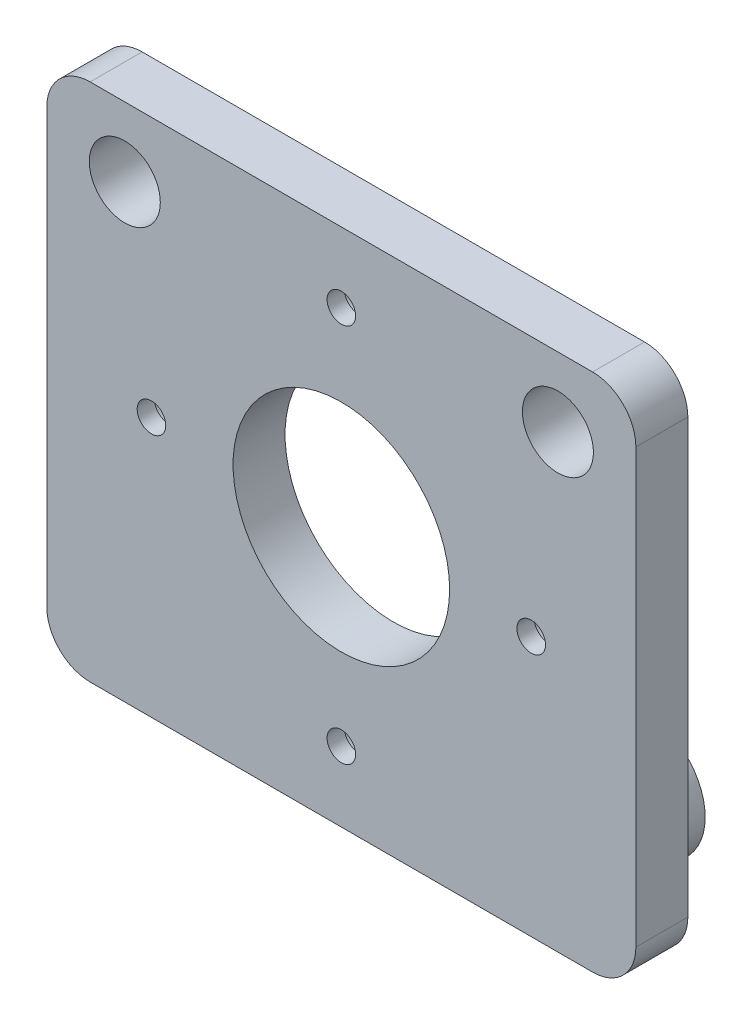
ISO-10303-21;
HEADER;
FILE_DESCRIPTION(('STEP AP214'),'2;1');
FILE_NAME('part.step','',(''),(''),'','','');
FILE_SCHEMA(('AUTOMOTIVE_DESIGN { 1 0 10303 214 1 1 1 1 }'));
ENDSEC;
DATA;
#1=APPLICATION_CONTEXT('core data for automotive mechanical design processes');
#2=APPLICATION_PROTOCOL_DEFINITION('international standard','automotive_design',2000,#1);
#3=PRODUCT_CONTEXT('',#1,'mechanical');
#4=PRODUCT('Part','Part','',(#3));
#5=PRODUCT_RELATED_PRODUCT_CATEGORY('part','',(#4));
#6=PRODUCT_DEFINITION_FORMATION('','',#4);
#7=PRODUCT_DEFINITION_CONTEXT('part definition',#1,'design');
#8=PRODUCT_DEFINITION('design','',#6,#7);
#9=PRODUCT_DEFINITION_SHAPE('','',#8);
#10=(LENGTH_UNIT() NAMED_UNIT(*) SI_UNIT(.MILLI.,.METRE.));
#11=(NAMED_UNIT(*) PLANE_ANGLE_UNIT() SI_UNIT($,.RADIAN.));
#12=(NAMED_UNIT(*) SI_UNIT($,.STERADIAN.) SOLID_ANGLE_UNIT());
#13=UNCERTAINTY_MEASURE_WITH_UNIT(LENGTH_MEASURE(1.E-05),#10,'distance_accuracy_value','');
#14=(GEOMETRIC_REPRESENTATION_CONTEXT(3) GLOBAL_UNCERTAINTY_ASSIGNED_CONTEXT((#13)) GLOBAL_UNIT_ASSIGNED_CONTEXT((#10,
#11,#12)) REPRESENTATION_CONTEXT('',''));
#15=CARTESIAN_POINT('',(0.,0.,0.));
#16=DIRECTION('',(0.,0.,1.));
#17=DIRECTION('',(1.,0.,0.));
#18=AXIS2_PLACEMENT_3D('',#15,#16,#17);
#19=CARTESIAN_POINT('',(0.,-21.920310216783,348.));
#20=DIRECTION('',(0.,0.,1.));
#21=DIRECTION('',(1.,0.,0.));
#22=AXIS2_PLACEMENT_3D('',#19,#20,#21);
#23=CYLINDRICAL_SURFACE('',#22,1.65);
#24=CARTESIAN_POINT('',(0.,-21.920310216783,354.));
#25=DIRECTION('',(0.,0.,1.));
#26=DIRECTION('',(1.,0.,0.));
#27=AXIS2_PLACEMENT_3D('',#24,#25,#26);
#28=CIRCLE('',#27,1.65);
#29=CARTESIAN_POINT('',(1.64999999999993,-21.920310216783,354.));
#30=VERTEX_POINT('',#29);
#31=EDGE_CURVE('E178',#30,#30,#28,.T.);
#32=ORIENTED_EDGE('',*,*,#31,.T.);
#33=EDGE_LOOP('',(#32));
#34=FACE_BOUND('',#33,.T.);
#35=CARTESIAN_POINT('',(0.,-21.920310216783,352.));
#36=DIRECTION('',(0.,0.,1.));
#37=DIRECTION('',(1.,0.,0.));
#38=AXIS2_PLACEMENT_3D('',#35,#36,#37);
#39=CIRCLE('',#38,1.65);
#40=CARTESIAN_POINT('',(1.64999999999993,-21.920310216783,352.));
#41=VERTEX_POINT('',#40);
#42=EDGE_CURVE('E435',#41,#41,#39,.T.);
#43=ORIENTED_EDGE('',*,*,#42,.F.);
#44=EDGE_LOOP('',(#43));
#45=FACE_BOUND('',#44,.T.);
#46=ADVANCED_FACE('F16',(#34,#45),#23,.F.);
#47=CARTESIAN_POINT('',(21.9203102167829,0.,348.));
#48=DIRECTION('',(0.,0.,1.));
#49=DIRECTION('',(1.,0.,0.));
#50=AXIS2_PLACEMENT_3D('',#47,#48,#49);
#51=CYLINDRICAL_SURFACE('',#50,1.65);
#52=CARTESIAN_POINT('',(21.9203102167829,0.,354.));
#53=DIRECTION('',(0.,0.,1.));
#54=DIRECTION('',(1.,0.,0.));
#55=AXIS2_PLACEMENT_3D('',#52,#53,#54);
#56=CIRCLE('',#55,1.65);
#57=CARTESIAN_POINT('',(23.5703102167829,0.,354.));
#58=VERTEX_POINT('',#57);
#59=EDGE_CURVE('E174',#58,#58,#56,.T.);
#60=ORIENTED_EDGE('',*,*,#59,.T.);
#61=EDGE_LOOP('',(#60));
#62=FACE_BOUND('',#61,.T.);
#63=CARTESIAN_POINT('',(21.9203102167829,0.,352.));
#64=DIRECTION('',(0.,0.,1.));
#65=DIRECTION('',(1.,0.,0.));
#66=AXIS2_PLACEMENT_3D('',#63,#64,#65);
#67=CIRCLE('',#66,1.65);
#68=CARTESIAN_POINT('',(23.5703102167829,0.,352.));
#69=VERTEX_POINT('',#68);
#70=EDGE_CURVE('E474',#69,#69,#67,.T.);
#71=ORIENTED_EDGE('',*,*,#70,.F.);
#72=EDGE_LOOP('',(#71));
#73=FACE_BOUND('',#72,.T.);
#74=ADVANCED_FACE('F286',(#62,#73),#51,.F.);
#75=CARTESIAN_POINT('',(0.,21.920310216783,348.));
#76=DIRECTION('',(0.,0.,1.));
#77=DIRECTION('',(1.,0.,0.));
#78=AXIS2_PLACEMENT_3D('',#75,#76,#77);
#79=CYLINDRICAL_SURFACE('',#78,1.65);
#80=CARTESIAN_POINT('',(0.,21.920310216783,354.));
#81=DIRECTION('',(0.,0.,1.));
#82=DIRECTION('',(1.,0.,0.));
#83=AXIS2_PLACEMENT_3D('',#80,#81,#82);
#84=CIRCLE('',#83,1.65);
#85=CARTESIAN_POINT('',(1.64999999999992,21.920310216783,354.));
#86=VERTEX_POINT('',#85);
#87=EDGE_CURVE('E170',#86,#86,#84,.T.);
#88=ORIENTED_EDGE('',*,*,#87,.T.);
#89=EDGE_LOOP('',(#88));
#90=FACE_BOUND('',#89,.T.);
#91=CARTESIAN_POINT('',(0.,21.920310216783,352.));
#92=DIRECTION('',(0.,0.,1.));
#93=DIRECTION('',(1.,0.,0.));
#94=AXIS2_PLACEMENT_3D('',#91,#92,#93);
#95=CIRCLE('',#94,1.65);
#96=CARTESIAN_POINT('',(1.64999999999992,21.920310216783,352.));
#97=VERTEX_POINT('',#96);
#98=EDGE_CURVE('E462',#97,#97,#95,.T.);
#99=ORIENTED_EDGE('',*,*,#98,.F.);
#100=EDGE_LOOP('',(#99));
#101=FACE_BOUND('',#100,.T.);
#102=ADVANCED_FACE('F292',(#90,#101),#79,.F.);
#103=CARTESIAN_POINT('',(-21.9203102167831,0.,348.));
#104=DIRECTION('',(0.,0.,1.));
#105=DIRECTION('',(1.,0.,0.));
#106=AXIS2_PLACEMENT_3D('',#103,#104,#105);
#107=CYLINDRICAL_SURFACE('',#106,1.65);
#108=CARTESIAN_POINT('',(-21.9203102167831,0.,354.));
#109=DIRECTION('',(0.,0.,1.));
#110=DIRECTION('',(1.,0.,0.));
#111=AXIS2_PLACEMENT_3D('',#108,#109,#110);
#112=CIRCLE('',#111,1.65);
#113=CARTESIAN_POINT('',(-20.2703102167831,0.,354.));
#114=VERTEX_POINT('',#113);
#115=EDGE_CURVE('E182',#114,#114,#112,.T.);
#116=ORIENTED_EDGE('',*,*,#115,.T.);
#117=EDGE_LOOP('',(#116));
#118=FACE_BOUND('',#117,.T.);
#119=CARTESIAN_POINT('',(-21.9203102167831,0.,352.));
#120=DIRECTION('',(0.,0.,1.));
#121=DIRECTION('',(1.,0.,0.));
#122=AXIS2_PLACEMENT_3D('',#119,#120,#121);
#123=CIRCLE('',#122,1.65);
#124=CARTESIAN_POINT('',(-20.2703102167831,0.,352.));
#125=VERTEX_POINT('',#124);
#126=EDGE_CURVE('E452',#125,#125,#123,.T.);
#127=ORIENTED_EDGE('',*,*,#126,.F.);
#128=EDGE_LOOP('',(#127));
#129=FACE_BOUND('',#128,.T.);
#130=ADVANCED_FACE('F297',(#118,#129),#107,.F.);
#131=CARTESIAN_POINT('',(34.,0.,348.));
#132=DIRECTION('',(-1.,0.,0.));
#133=DIRECTION('',(0.,-1.,0.));
#134=AXIS2_PLACEMENT_3D('',#131,#132,#133);
#135=PLANE('',#134);
#136=DIRECTION('',(0.,-1.,0.));
#137=VECTOR('',#136,1.);
#138=CARTESIAN_POINT('',(34.,0.,348.));
#139=LINE('',#138,#137);
#140=CARTESIAN_POINT('',(34.,25.,348.));
#141=VERTEX_POINT('',#140);
#142=CARTESIAN_POINT('',(34.,-25.,348.));
#143=VERTEX_POINT('',#142);
#144=EDGE_CURVE('E125',#141,#143,#139,.T.);
#145=ORIENTED_EDGE('',*,*,#144,.F.);
#146=DIRECTION('',(0.,0.,1.));
#147=VECTOR('',#146,1.);
#148=CARTESIAN_POINT('',(34.,25.,354.));
#149=LINE('',#148,#147);
#150=CARTESIAN_POINT('',(34.,25.,354.));
#151=VERTEX_POINT('',#150);
#152=EDGE_CURVE('E108',#141,#151,#149,.T.);
#153=ORIENTED_EDGE('',*,*,#152,.T.);
#154=DIRECTION('',(0.,-1.,0.));
#155=VECTOR('',#154,1.);
#156=CARTESIAN_POINT('',(34.,0.,354.));
#157=LINE('',#156,#155);
#158=CARTESIAN_POINT('',(34.,-25.,354.));
#159=VERTEX_POINT('',#158);
#160=EDGE_CURVE('E122',#151,#159,#157,.T.);
#161=ORIENTED_EDGE('',*,*,#160,.T.);
#162=DIRECTION('',(0.,0.,1.));
#163=VECTOR('',#162,1.);
#164=CARTESIAN_POINT('',(34.,-25.,348.));
#165=LINE('',#164,#163);
#166=EDGE_CURVE('E128',#159,#143,#165,.F.);
#167=ORIENTED_EDGE('',*,*,#166,.T.);
#168=EDGE_LOOP('',(#145,#153,#161,#167));
#169=FACE_BOUND('',#168,.T.);
#170=ADVANCED_FACE('F121',(#169),#135,.F.);
#171=CARTESIAN_POINT('',(0.,30.,348.));
#172=DIRECTION('',(0.,1.,0.));
#173=DIRECTION('',(-1.,0.,0.));
#174=AXIS2_PLACEMENT_3D('',#171,#172,#173);
#175=PLANE('',#174);
#176=DIRECTION('',(-1.,0.,0.));
#177=VECTOR('',#176,1.);
#178=CARTESIAN_POINT('',(0.,30.,354.));
#179=LINE('',#178,#177);
#180=CARTESIAN_POINT('',(29.,30.,354.));
#181=VERTEX_POINT('',#180);
#182=CARTESIAN_POINT('',(-29.,30.,354.));
#183=VERTEX_POINT('',#182);
#184=EDGE_CURVE('E134',#181,#183,#179,.T.);
#185=ORIENTED_EDGE('',*,*,#184,.F.);
#186=DIRECTION('',(0.,0.,1.));
#187=VECTOR('',#186,1.);
#188=CARTESIAN_POINT('',(29.,30.,348.));
#189=LINE('',#188,#187);
#190=CARTESIAN_POINT('',(29.,30.,348.));
#191=VERTEX_POINT('',#190);
#192=EDGE_CURVE('E109',#181,#191,#189,.F.);
#193=ORIENTED_EDGE('',*,*,#192,.T.);
#194=DIRECTION('',(-1.,0.,0.));
#195=VECTOR('',#194,1.);
#196=CARTESIAN_POINT('',(0.,30.,348.));
#197=LINE('',#196,#195);
#198=CARTESIAN_POINT('',(-29.,30.,348.));
#199=VERTEX_POINT('',#198);
#200=EDGE_CURVE('E238',#191,#199,#197,.T.);
#201=ORIENTED_EDGE('',*,*,#200,.T.);
#202=DIRECTION('',(0.,0.,1.));
#203=VECTOR('',#202,1.);
#204=CARTESIAN_POINT('',(-29.,30.,348.));
#205=LINE('',#204,#203);
#206=EDGE_CURVE('E115',#199,#183,#205,.T.);
#207=ORIENTED_EDGE('',*,*,#206,.T.);
#208=EDGE_LOOP('',(#185,#193,#201,#207));
#209=FACE_BOUND('',#208,.T.);
#210=ADVANCED_FACE('F319',(#209),#175,.T.);
#211=CARTESIAN_POINT('',(-34.,0.,348.));
#212=DIRECTION('',(-1.,0.,0.));
#213=DIRECTION('',(0.,-1.,0.));
#214=AXIS2_PLACEMENT_3D('',#211,#212,#213);
#215=PLANE('',#214);
#216=DIRECTION('',(0.,-1.,0.));
#217=VECTOR('',#216,1.);
#218=CARTESIAN_POINT('',(-34.,0.,354.));
#219=LINE('',#218,#217);
#220=CARTESIAN_POINT('',(-34.,25.,354.));
#221=VERTEX_POINT('',#220);
#222=CARTESIAN_POINT('',(-34.,-25.,354.));
#223=VERTEX_POINT('',#222);
#224=EDGE_CURVE('E141',#221,#223,#219,.T.);
#225=ORIENTED_EDGE('',*,*,#224,.F.);
#226=DIRECTION('',(0.,0.,1.));
#227=VECTOR('',#226,1.);
#228=CARTESIAN_POINT('',(-34.,25.,348.));
#229=LINE('',#228,#227);
#230=CARTESIAN_POINT('',(-34.,25.,348.));
#231=VERTEX_POINT('',#230);
#232=EDGE_CURVE('E48',#221,#231,#229,.F.);
#233=ORIENTED_EDGE('',*,*,#232,.T.);
#234=DIRECTION('',(0.,-1.,0.));
#235=VECTOR('',#234,1.);
#236=CARTESIAN_POINT('',(-34.,0.,348.));
#237=LINE('',#236,#235);
#238=CARTESIAN_POINT('',(-34.,-25.,348.));
#239=VERTEX_POINT('',#238);
#240=EDGE_CURVE('E235',#231,#239,#237,.T.);
#241=ORIENTED_EDGE('',*,*,#240,.T.);
#242=DIRECTION('',(0.,0.,1.));
#243=VECTOR('',#242,1.);
#244=CARTESIAN_POINT('',(-34.,-25.,354.));
#245=LINE('',#244,#243);
#246=EDGE_CURVE('E215',#239,#223,#245,.T.);
#247=ORIENTED_EDGE('',*,*,#246,.T.);
#248=EDGE_LOOP('',(#225,#233,#241,#247));
#249=FACE_BOUND('',#248,.T.);
#250=ADVANCED_FACE('F234',(#249),#215,.T.);
#251=CARTESIAN_POINT('',(0.,0.,348.));
#252=DIRECTION('',(0.,0.,1.));
#253=DIRECTION('',(1.,0.,0.));
#254=AXIS2_PLACEMENT_3D('',#251,#252,#253);
#255=CYLINDRICAL_SURFACE('',#254,12.5);
#256=CARTESIAN_POINT('',(0.,0.,348.));
#257=DIRECTION('',(0.,0.,1.));
#258=DIRECTION('',(1.,0.,0.));
#259=AXIS2_PLACEMENT_3D('',#256,#257,#258);
#260=CIRCLE('',#259,12.5);
#261=CARTESIAN_POINT('',(12.4999999999999,0.,348.));
#262=VERTEX_POINT('',#261);
#263=EDGE_CURVE('E148',#262,#262,#260,.T.);
#264=ORIENTED_EDGE('',*,*,#263,.F.);
#265=EDGE_LOOP('',(#264));
#266=FACE_BOUND('',#265,.T.);
#267=CARTESIAN_POINT('',(0.,0.,354.));
#268=DIRECTION('',(0.,0.,1.));
#269=DIRECTION('',(1.,0.,0.));
#270=AXIS2_PLACEMENT_3D('',#267,#268,#269);
#271=CIRCLE('',#270,12.5);
#272=CARTESIAN_POINT('',(12.4999999999999,0.,354.));
#273=VERTEX_POINT('',#272);
#274=EDGE_CURVE('E166',#273,#273,#271,.T.);
#275=ORIENTED_EDGE('',*,*,#274,.T.);
#276=EDGE_LOOP('',(#275));
#277=FACE_BOUND('',#276,.T.);
#278=ADVANCED_FACE('F303',(#266,#277),#255,.F.);
#279=CARTESIAN_POINT('',(-25.,22.,348.));
#280=DIRECTION('',(0.,0.,1.));
#281=DIRECTION('',(1.,0.,0.));
#282=AXIS2_PLACEMENT_3D('',#279,#280,#281);
#283=CYLINDRICAL_SURFACE('',#282,4.1);
#284=CARTESIAN_POINT('',(-25.,22.,348.));
#285=DIRECTION('',(0.,0.,1.));
#286=DIRECTION('',(1.,0.,0.));
#287=AXIS2_PLACEMENT_3D('',#284,#285,#286);
#288=CIRCLE('',#287,4.1);
#289=CARTESIAN_POINT('',(-20.9,22.,348.));
#290=VERTEX_POINT('',#289);
#291=EDGE_CURVE('E251',#290,#290,#288,.T.);
#292=ORIENTED_EDGE('',*,*,#291,.F.);
#293=EDGE_LOOP('',(#292));
#294=FACE_BOUND('',#293,.T.);
#295=CARTESIAN_POINT('',(-25.,22.,354.));
#296=DIRECTION('',(0.,0.,1.));
#297=DIRECTION('',(1.,0.,0.));
#298=AXIS2_PLACEMENT_3D('',#295,#296,#297);
#299=CIRCLE('',#298,4.1);
#300=CARTESIAN_POINT('',(-20.9,22.,354.));
#301=VERTEX_POINT('',#300);
#302=EDGE_CURVE('E162',#301,#301,#299,.T.);
#303=ORIENTED_EDGE('',*,*,#302,.T.);
#304=EDGE_LOOP('',(#303));
#305=FACE_BOUND('',#304,.T.);
#306=ADVANCED_FACE('F306',(#294,#305),#283,.F.);
#307=CARTESIAN_POINT('',(25.,22.,348.));
#308=DIRECTION('',(0.,0.,1.));
#309=DIRECTION('',(1.,0.,0.));
#310=AXIS2_PLACEMENT_3D('',#307,#308,#309);
#311=CYLINDRICAL_SURFACE('',#310,4.1);
#312=CARTESIAN_POINT('',(25.,22.,348.));
#313=DIRECTION('',(0.,0.,1.));
#314=DIRECTION('',(1.,0.,0.));
#315=AXIS2_PLACEMENT_3D('',#312,#313,#314);
#316=CIRCLE('',#315,4.1);
#317=CARTESIAN_POINT('',(29.1,22.,348.));
#318=VERTEX_POINT('',#317);
#319=EDGE_CURVE('E242',#318,#318,#316,.T.);
#320=ORIENTED_EDGE('',*,*,#319,.F.);
#321=EDGE_LOOP('',(#320));
#322=FACE_BOUND('',#321,.T.);
#323=CARTESIAN_POINT('',(25.,22.,354.));
#324=DIRECTION('',(0.,0.,1.));
#325=DIRECTION('',(1.,0.,0.));
#326=AXIS2_PLACEMENT_3D('',#323,#324,#325);
#327=CIRCLE('',#326,4.1);
#328=CARTESIAN_POINT('',(29.1,22.,354.));
#329=VERTEX_POINT('',#328);
#330=EDGE_CURVE('E158',#329,#329,#327,.T.);
#331=ORIENTED_EDGE('',*,*,#330,.T.);
#332=EDGE_LOOP('',(#331));
#333=FACE_BOUND('',#332,.T.);
#334=ADVANCED_FACE('F310',(#322,#333),#311,.F.);
#335=CARTESIAN_POINT('',(0.,-30.,348.));
#336=DIRECTION('',(0.,1.,0.));
#337=DIRECTION('',(-1.,0.,0.));
#338=AXIS2_PLACEMENT_3D('',#335,#336,#337);
#339=PLANE('',#338);
#340=DIRECTION('',(-1.,0.,0.));
#341=VECTOR('',#340,1.);
#342=CARTESIAN_POINT('',(0.,-30.,354.));
#343=LINE('',#342,#341);
#344=CARTESIAN_POINT('',(29.,-30.,354.));
#345=VERTEX_POINT('',#344);
#346=CARTESIAN_POINT('',(-29.,-30.,354.));
#347=VERTEX_POINT('',#346);
#348=EDGE_CURVE('E154',#345,#347,#343,.T.);
#349=ORIENTED_EDGE('',*,*,#348,.T.);
#350=DIRECTION('',(0.,0.,1.));
#351=VECTOR('',#350,1.);
#352=CARTESIAN_POINT('',(-29.,-30.,348.));
#353=LINE('',#352,#351);
#354=CARTESIAN_POINT('',(-29.,-30.,348.));
#355=VERTEX_POINT('',#354);
#356=EDGE_CURVE('E10',#347,#355,#353,.F.);
#357=ORIENTED_EDGE('',*,*,#356,.T.);
#358=DIRECTION('',(-1.,0.,0.));
#359=VECTOR('',#358,1.);
#360=CARTESIAN_POINT('',(0.,-30.,348.));
#361=LINE('',#360,#359);
#362=CARTESIAN_POINT('',(29.,-30.,348.));
#363=VERTEX_POINT('',#362);
#364=EDGE_CURVE('E228',#363,#355,#361,.T.);
#365=ORIENTED_EDGE('',*,*,#364,.F.);
#366=DIRECTION('',(0.,0.,1.));
#367=VECTOR('',#366,1.);
#368=CARTESIAN_POINT('',(29.,-30.,348.));
#369=LINE('',#368,#367);
#370=EDGE_CURVE('E25',#363,#345,#369,.T.);
#371=ORIENTED_EDGE('',*,*,#370,.T.);
#372=EDGE_LOOP('',(#349,#357,#365,#371));
#373=FACE_BOUND('',#372,.T.);
#374=ADVANCED_FACE('F226',(#373),#339,.F.);
#375=CARTESIAN_POINT('',(0.,0.,348.));
#376=DIRECTION('',(0.,0.,1.));
#377=DIRECTION('',(1.,0.,0.));
#378=AXIS2_PLACEMENT_3D('',#375,#376,#377);
#379=PLANE('',#378);
#380=CARTESIAN_POINT('',(0.,-21.920310216783,348.));
#381=DIRECTION('',(0.,0.,-1.));
#382=DIRECTION('',(1.,0.,0.));
#383=AXIS2_PLACEMENT_3D('',#380,#381,#382);
#384=CIRCLE('',#383,3.);
#385=CARTESIAN_POINT('',(2.99999999999993,-21.920310216783,348.));
#386=VERTEX_POINT('',#385);
#387=EDGE_CURVE('E440',#386,#386,#384,.T.);
#388=ORIENTED_EDGE('',*,*,#387,.F.);
#389=EDGE_LOOP('',(#388));
#390=FACE_BOUND('',#389,.T.);
#391=CARTESIAN_POINT('',(-21.9203102167831,0.,348.));
#392=DIRECTION('',(0.,0.,-1.));
#393=DIRECTION('',(1.,0.,0.));
#394=AXIS2_PLACEMENT_3D('',#391,#392,#393);
#395=CIRCLE('',#394,3.);
#396=CARTESIAN_POINT('',(-18.9203102167831,0.,348.));
#397=VERTEX_POINT('',#396);
#398=EDGE_CURVE('E456',#397,#397,#395,.T.);
#399=ORIENTED_EDGE('',*,*,#398,.F.);
#400=EDGE_LOOP('',(#399));
#401=FACE_BOUND('',#400,.T.);
#402=CARTESIAN_POINT('',(0.,21.920310216783,348.));
#403=DIRECTION('',(0.,0.,-1.));
#404=DIRECTION('',(1.,0.,0.));
#405=AXIS2_PLACEMENT_3D('',#402,#403,#404);
#406=CIRCLE('',#405,3.);
#407=CARTESIAN_POINT('',(2.99999999999992,21.920310216783,348.));
#408=VERTEX_POINT('',#407);
#409=EDGE_CURVE('E467',#408,#408,#406,.T.);
#410=ORIENTED_EDGE('',*,*,#409,.F.);
#411=EDGE_LOOP('',(#410));
#412=FACE_BOUND('',#411,.T.);
#413=CARTESIAN_POINT('',(21.9203102167829,0.,348.));
#414=DIRECTION('',(0.,0.,-1.));
#415=DIRECTION('',(1.,0.,0.));
#416=AXIS2_PLACEMENT_3D('',#413,#414,#415);
#417=CIRCLE('',#416,3.);
#418=CARTESIAN_POINT('',(24.9203102167829,0.,348.));
#419=VERTEX_POINT('',#418);
#420=EDGE_CURVE('E479',#419,#419,#417,.T.);
#421=ORIENTED_EDGE('',*,*,#420,.F.);
#422=EDGE_LOOP('',(#421));
#423=FACE_BOUND('',#422,.T.);
#424=CARTESIAN_POINT('',(-25.,-18.,348.));
#425=DIRECTION('',(0.,0.,1.));
#426=DIRECTION('',(1.,0.,0.));
#427=AXIS2_PLACEMENT_3D('',#424,#425,#426);
#428=CIRCLE('',#427,7.);
#429=CARTESIAN_POINT('',(-18.,-18.,348.));
#430=VERTEX_POINT('',#429);
#431=EDGE_CURVE('E186',#430,#430,#428,.F.);
#432=ORIENTED_EDGE('',*,*,#431,.F.);
#433=EDGE_LOOP('',(#432));
#434=FACE_BOUND('',#433,.T.);
#435=CARTESIAN_POINT('',(25.,-18.,348.));
#436=DIRECTION('',(0.,0.,-1.));
#437=DIRECTION('',(1.,0.,0.));
#438=AXIS2_PLACEMENT_3D('',#435,#436,#437);
#439=CIRCLE('',#438,7.);
#440=CARTESIAN_POINT('',(32.,-18.,348.));
#441=VERTEX_POINT('',#440);
#442=EDGE_CURVE('E190',#441,#441,#439,.T.);
#443=ORIENTED_EDGE('',*,*,#442,.F.);
#444=EDGE_LOOP('',(#443));
#445=FACE_BOUND('',#444,.T.);
#446=ORIENTED_EDGE('',*,*,#200,.F.);
#447=CARTESIAN_POINT('',(29.,25.,348.));
#448=DIRECTION('',(0.,0.,1.));
#449=DIRECTION('',(1.,0.,0.));
#450=AXIS2_PLACEMENT_3D('',#447,#448,#449);
#451=CIRCLE('',#450,5.);
#452=EDGE_CURVE('E212',#191,#141,#451,.F.);
#453=ORIENTED_EDGE('',*,*,#452,.T.);
#454=ORIENTED_EDGE('',*,*,#144,.T.);
#455=CARTESIAN_POINT('',(29.,-25.,348.));
#456=DIRECTION('',(0.,0.,1.));
#457=DIRECTION('',(1.,0.,0.));
#458=AXIS2_PLACEMENT_3D('',#455,#456,#457);
#459=CIRCLE('',#458,5.);
#460=EDGE_CURVE('E204',#143,#363,#459,.F.);
#461=ORIENTED_EDGE('',*,*,#460,.T.);
#462=ORIENTED_EDGE('',*,*,#364,.T.);
#463=CARTESIAN_POINT('',(-29.,-25.,348.));
#464=DIRECTION('',(0.,0.,1.));
#465=DIRECTION('',(1.,0.,0.));
#466=AXIS2_PLACEMENT_3D('',#463,#464,#465);
#467=CIRCLE('',#466,5.);
#468=EDGE_CURVE('E37',#355,#239,#467,.F.);
#469=ORIENTED_EDGE('',*,*,#468,.T.);
#470=ORIENTED_EDGE('',*,*,#240,.F.);
#471=CARTESIAN_POINT('',(-29.,25.,348.));
#472=DIRECTION('',(0.,0.,1.));
#473=DIRECTION('',(1.,0.,0.));
#474=AXIS2_PLACEMENT_3D('',#471,#472,#473);
#475=CIRCLE('',#474,5.);
#476=EDGE_CURVE('E209',#231,#199,#475,.F.);
#477=ORIENTED_EDGE('',*,*,#476,.T.);
#478=EDGE_LOOP('',(#446,#453,#454,#461,#462,#469,#470,#477));
#479=FACE_BOUND('',#478,.T.);
#480=ORIENTED_EDGE('',*,*,#319,.T.);
#481=EDGE_LOOP('',(#480));
#482=FACE_BOUND('',#481,.T.);
#483=ORIENTED_EDGE('',*,*,#291,.T.);
#484=EDGE_LOOP('',(#483));
#485=FACE_BOUND('',#484,.T.);
#486=ORIENTED_EDGE('',*,*,#263,.T.);
#487=EDGE_LOOP('',(#486));
#488=FACE_BOUND('',#487,.T.);
#489=ADVANCED_FACE('F277',(#390,#401,#412,#423,#434,#445,#479,#482,#485,#488),#379,.F.);
#490=CARTESIAN_POINT('',(0.,0.,354.));
#491=DIRECTION('',(0.,0.,1.));
#492=DIRECTION('',(1.,0.,0.));
#493=AXIS2_PLACEMENT_3D('',#490,#491,#492);
#494=PLANE('',#493);
#495=ORIENTED_EDGE('',*,*,#160,.F.);
#496=CARTESIAN_POINT('',(29.,25.,354.));
#497=DIRECTION('',(0.,0.,1.));
#498=DIRECTION('',(1.,0.,0.));
#499=AXIS2_PLACEMENT_3D('',#496,#497,#498);
#500=CIRCLE('',#499,5.);
#501=EDGE_CURVE('E104',#151,#181,#500,.T.);
#502=ORIENTED_EDGE('',*,*,#501,.T.);
#503=ORIENTED_EDGE('',*,*,#184,.T.);
#504=CARTESIAN_POINT('',(-29.,25.,354.));
#505=DIRECTION('',(0.,0.,1.));
#506=DIRECTION('',(1.,0.,0.));
#507=AXIS2_PLACEMENT_3D('',#504,#505,#506);
#508=CIRCLE('',#507,5.);
#509=EDGE_CURVE('E116',#183,#221,#508,.T.);
#510=ORIENTED_EDGE('',*,*,#509,.T.);
#511=ORIENTED_EDGE('',*,*,#224,.T.);
#512=CARTESIAN_POINT('',(-29.,-25.,354.));
#513=DIRECTION('',(0.,0.,1.));
#514=DIRECTION('',(1.,0.,0.));
#515=AXIS2_PLACEMENT_3D('',#512,#513,#514);
#516=CIRCLE('',#515,5.);
#517=EDGE_CURVE('E195',#223,#347,#516,.T.);
#518=ORIENTED_EDGE('',*,*,#517,.T.);
#519=ORIENTED_EDGE('',*,*,#348,.F.);
#520=CARTESIAN_POINT('',(29.,-25.,354.));
#521=DIRECTION('',(0.,0.,1.));
#522=DIRECTION('',(1.,0.,0.));
#523=AXIS2_PLACEMENT_3D('',#520,#521,#522);
#524=CIRCLE('',#523,5.);
#525=EDGE_CURVE('E127',#345,#159,#524,.T.);
#526=ORIENTED_EDGE('',*,*,#525,.T.);
#527=EDGE_LOOP('',(#495,#502,#503,#510,#511,#518,#519,#526));
#528=FACE_BOUND('',#527,.T.);
#529=ORIENTED_EDGE('',*,*,#330,.F.);
#530=EDGE_LOOP('',(#529));
#531=FACE_BOUND('',#530,.T.);
#532=ORIENTED_EDGE('',*,*,#302,.F.);
#533=EDGE_LOOP('',(#532));
#534=FACE_BOUND('',#533,.T.);
#535=ORIENTED_EDGE('',*,*,#274,.F.);
#536=EDGE_LOOP('',(#535));
#537=FACE_BOUND('',#536,.T.);
#538=ORIENTED_EDGE('',*,*,#87,.F.);
#539=EDGE_LOOP('',(#538));
#540=FACE_BOUND('',#539,.T.);
#541=ORIENTED_EDGE('',*,*,#59,.F.);
#542=EDGE_LOOP('',(#541));
#543=FACE_BOUND('',#542,.T.);
#544=ORIENTED_EDGE('',*,*,#31,.F.);
#545=EDGE_LOOP('',(#544));
#546=FACE_BOUND('',#545,.T.);
#547=ORIENTED_EDGE('',*,*,#115,.F.);
#548=EDGE_LOOP('',(#547));
#549=FACE_BOUND('',#548,.T.);
#550=ADVANCED_FACE('F130',(#528,#531,#534,#537,#540,#543,#546,#549),#494,.T.);
#551=CARTESIAN_POINT('',(25.,-18.,344.));
#552=DIRECTION('',(0.,0.,1.));
#553=DIRECTION('',(1.,0.,0.));
#554=AXIS2_PLACEMENT_3D('',#551,#552,#553);
#555=CYLINDRICAL_SURFACE('',#554,7.);
#556=CARTESIAN_POINT('',(25.,-18.,344.));
#557=DIRECTION('',(0.,0.,-1.));
#558=DIRECTION('',(1.,0.,0.));
#559=AXIS2_PLACEMENT_3D('',#556,#557,#558);
#560=CIRCLE('',#559,7.);
#561=CARTESIAN_POINT('',(32.,-18.,344.));
#562=VERTEX_POINT('',#561);
#563=EDGE_CURVE('E270',#562,#562,#560,.T.);
#564=ORIENTED_EDGE('',*,*,#563,.F.);
#565=EDGE_LOOP('',(#564));
#566=FACE_BOUND('',#565,.T.);
#567=ORIENTED_EDGE('',*,*,#442,.T.);
#568=EDGE_LOOP('',(#567));
#569=FACE_BOUND('',#568,.T.);
#570=ADVANCED_FACE('F350',(#566,#569),#555,.T.);
#571=CARTESIAN_POINT('',(0.,0.,344.));
#572=DIRECTION('',(0.,0.,-1.));
#573=DIRECTION('',(1.,0.,0.));
#574=AXIS2_PLACEMENT_3D('',#571,#572,#573);
#575=PLANE('',#574);
#576=CARTESIAN_POINT('',(25.,-18.,344.));
#577=DIRECTION('',(0.,0.,1.));
#578=DIRECTION('',(1.,0.,0.));
#579=AXIS2_PLACEMENT_3D('',#576,#577,#578);
#580=CIRCLE('',#579,4.15);
#581=CARTESIAN_POINT('',(29.15,-18.,344.));
#582=VERTEX_POINT('',#581);
#583=EDGE_CURVE('E492',#582,#582,#580,.T.);
#584=ORIENTED_EDGE('',*,*,#583,.T.);
#585=EDGE_LOOP('',(#584));
#586=FACE_BOUND('',#585,.T.);
#587=ORIENTED_EDGE('',*,*,#563,.T.);
#588=EDGE_LOOP('',(#587));
#589=FACE_BOUND('',#588,.T.);
#590=ADVANCED_FACE('F389',(#586,#589),#575,.T.);
#591=CARTESIAN_POINT('',(0.,-18.,352.));
#592=DIRECTION('',(0.,0.,-1.));
#593=DIRECTION('',(1.,0.,0.));
#594=AXIS2_PLACEMENT_3D('',#591,#592,#593);
#595=PLANE('',#594);
#596=CARTESIAN_POINT('',(25.,-18.,352.));
#597=DIRECTION('',(0.,0.,1.));
#598=DIRECTION('',(-1.,0.,0.));
#599=AXIS2_PLACEMENT_3D('',#596,#597,#598);
#600=CIRCLE('',#599,4.15);
#601=CARTESIAN_POINT('',(20.85,-18.,352.));
#602=VERTEX_POINT('',#601);
#603=EDGE_CURVE('E135',#602,#602,#600,.T.);
#604=ORIENTED_EDGE('',*,*,#603,.F.);
#605=EDGE_LOOP('',(#604));
#606=FACE_BOUND('',#605,.T.);
#607=ADVANCED_FACE('F385',(#606),#595,.T.);
#608=CARTESIAN_POINT('',(25.,-18.,327.));
#609=DIRECTION('',(0.,0.,1.));
#610=DIRECTION('',(1.,0.,0.));
#611=AXIS2_PLACEMENT_3D('',#608,#609,#610);
#612=CYLINDRICAL_SURFACE('',#611,4.15);
#613=ORIENTED_EDGE('',*,*,#603,.T.);
#614=EDGE_LOOP('',(#613));
#615=FACE_BOUND('',#614,.T.);
#616=ORIENTED_EDGE('',*,*,#583,.F.);
#617=EDGE_LOOP('',(#616));
#618=FACE_BOUND('',#617,.T.);
#619=ADVANCED_FACE('F381',(#615,#618),#612,.F.);
#620=CARTESIAN_POINT('',(-25.,-18.,344.));
#621=DIRECTION('',(0.,0.,1.));
#622=DIRECTION('',(1.,0.,0.));
#623=AXIS2_PLACEMENT_3D('',#620,#621,#622);
#624=CYLINDRICAL_SURFACE('',#623,7.);
#625=CARTESIAN_POINT('',(-25.,-18.,344.));
#626=DIRECTION('',(0.,0.,-1.));
#627=DIRECTION('',(1.,0.,0.));
#628=AXIS2_PLACEMENT_3D('',#625,#626,#627);
#629=CIRCLE('',#628,7.);
#630=CARTESIAN_POINT('',(-18.,-18.,344.));
#631=VERTEX_POINT('',#630);
#632=EDGE_CURVE('E446',#631,#631,#629,.T.);
#633=ORIENTED_EDGE('',*,*,#632,.F.);
#634=EDGE_LOOP('',(#633));
#635=FACE_BOUND('',#634,.T.);
#636=ORIENTED_EDGE('',*,*,#431,.T.);
#637=EDGE_LOOP('',(#636));
#638=FACE_BOUND('',#637,.T.);
#639=ADVANCED_FACE('F384',(#635,#638),#624,.T.);
#640=CARTESIAN_POINT('',(0.,0.,344.));
#641=DIRECTION('',(0.,0.,-1.));
#642=DIRECTION('',(1.,0.,0.));
#643=AXIS2_PLACEMENT_3D('',#640,#641,#642);
#644=PLANE('',#643);
#645=CARTESIAN_POINT('',(-25.,-18.,344.));
#646=DIRECTION('',(0.,0.,1.));
#647=DIRECTION('',(1.,0.,0.));
#648=AXIS2_PLACEMENT_3D('',#645,#646,#647);
#649=CIRCLE('',#648,4.15);
#650=CARTESIAN_POINT('',(-20.85,-18.,344.));
#651=VERTEX_POINT('',#650);
#652=EDGE_CURVE('E489',#651,#651,#649,.T.);
#653=ORIENTED_EDGE('',*,*,#652,.T.);
#654=EDGE_LOOP('',(#653));
#655=FACE_BOUND('',#654,.T.);
#656=ORIENTED_EDGE('',*,*,#632,.T.);
#657=EDGE_LOOP('',(#656));
#658=FACE_BOUND('',#657,.T.);
#659=ADVANCED_FACE('F379',(#655,#658),#644,.T.);
#660=CARTESIAN_POINT('',(0.,-18.,352.));
#661=DIRECTION('',(0.,0.,-1.));
#662=DIRECTION('',(1.,0.,0.));
#663=AXIS2_PLACEMENT_3D('',#660,#661,#662);
#664=PLANE('',#663);
#665=CARTESIAN_POINT('',(-25.,-18.,352.));
#666=DIRECTION('',(0.,0.,1.));
#667=DIRECTION('',(-1.,0.,0.));
#668=AXIS2_PLACEMENT_3D('',#665,#666,#667);
#669=CIRCLE('',#668,4.15);
#670=CARTESIAN_POINT('',(-29.15,-18.,352.));
#671=VERTEX_POINT('',#670);
#672=EDGE_CURVE('E145',#671,#671,#669,.T.);
#673=ORIENTED_EDGE('',*,*,#672,.F.);
#674=EDGE_LOOP('',(#673));
#675=FACE_BOUND('',#674,.T.);
#676=ADVANCED_FACE('F375',(#675),#664,.T.);
#677=CARTESIAN_POINT('',(-25.,-18.,327.));
#678=DIRECTION('',(0.,0.,1.));
#679=DIRECTION('',(1.,0.,0.));
#680=AXIS2_PLACEMENT_3D('',#677,#678,#679);
#681=CYLINDRICAL_SURFACE('',#680,4.15);
#682=ORIENTED_EDGE('',*,*,#672,.T.);
#683=EDGE_LOOP('',(#682));
#684=FACE_BOUND('',#683,.T.);
#685=ORIENTED_EDGE('',*,*,#652,.F.);
#686=EDGE_LOOP('',(#685));
#687=FACE_BOUND('',#686,.T.);
#688=ADVANCED_FACE('F371',(#684,#687),#681,.F.);
#689=CARTESIAN_POINT('',(21.9203102167829,0.,352.));
#690=DIRECTION('',(0.,0.,-1.));
#691=DIRECTION('',(-1.,0.,0.));
#692=AXIS2_PLACEMENT_3D('',#689,#690,#691);
#693=CYLINDRICAL_SURFACE('',#692,3.);
#694=CARTESIAN_POINT('',(21.9203102167829,0.,352.));
#695=DIRECTION('',(0.,0.,-1.));
#696=DIRECTION('',(1.,0.,0.));
#697=AXIS2_PLACEMENT_3D('',#694,#695,#696);
#698=CIRCLE('',#697,3.);
#699=CARTESIAN_POINT('',(24.9203102167829,0.,352.));
#700=VERTEX_POINT('',#699);
#701=EDGE_CURVE('E475',#700,#700,#698,.T.);
#702=ORIENTED_EDGE('',*,*,#701,.F.);
#703=EDGE_LOOP('',(#702));
#704=FACE_BOUND('',#703,.T.);
#705=ORIENTED_EDGE('',*,*,#420,.T.);
#706=EDGE_LOOP('',(#705));
#707=FACE_BOUND('',#706,.T.);
#708=ADVANCED_FACE('F374',(#704,#707),#693,.F.);
#709=CARTESIAN_POINT('',(0.,0.,352.));
#710=DIRECTION('',(0.,0.,-1.));
#711=DIRECTION('',(1.,0.,0.));
#712=AXIS2_PLACEMENT_3D('',#709,#710,#711);
#713=PLANE('',#712);
#714=ORIENTED_EDGE('',*,*,#70,.T.);
#715=EDGE_LOOP('',(#714));
#716=FACE_BOUND('',#715,.T.);
#717=ORIENTED_EDGE('',*,*,#701,.T.);
#718=EDGE_LOOP('',(#717));
#719=FACE_BOUND('',#718,.T.);
#720=ADVANCED_FACE('F404',(#716,#719),#713,.T.);
#721=CARTESIAN_POINT('',(0.,21.920310216783,352.));
#722=DIRECTION('',(0.,0.,-1.));
#723=DIRECTION('',(-1.,0.,0.));
#724=AXIS2_PLACEMENT_3D('',#721,#722,#723);
#725=CYLINDRICAL_SURFACE('',#724,3.);
#726=CARTESIAN_POINT('',(0.,21.920310216783,352.));
#727=DIRECTION('',(0.,0.,-1.));
#728=DIRECTION('',(1.,0.,0.));
#729=AXIS2_PLACEMENT_3D('',#726,#727,#728);
#730=CIRCLE('',#729,3.);
#731=CARTESIAN_POINT('',(2.99999999999992,21.920310216783,352.));
#732=VERTEX_POINT('',#731);
#733=EDGE_CURVE('E463',#732,#732,#730,.T.);
#734=ORIENTED_EDGE('',*,*,#733,.F.);
#735=EDGE_LOOP('',(#734));
#736=FACE_BOUND('',#735,.T.);
#737=ORIENTED_EDGE('',*,*,#409,.T.);
#738=EDGE_LOOP('',(#737));
#739=FACE_BOUND('',#738,.T.);
#740=ADVANCED_FACE('F408',(#736,#739),#725,.F.);
#741=CARTESIAN_POINT('',(0.,0.,352.));
#742=DIRECTION('',(0.,0.,-1.));
#743=DIRECTION('',(1.,0.,0.));
#744=AXIS2_PLACEMENT_3D('',#741,#742,#743);
#745=PLANE('',#744);
#746=ORIENTED_EDGE('',*,*,#98,.T.);
#747=EDGE_LOOP('',(#746));
#748=FACE_BOUND('',#747,.T.);
#749=ORIENTED_EDGE('',*,*,#733,.T.);
#750=EDGE_LOOP('',(#749));
#751=FACE_BOUND('',#750,.T.);
#752=ADVANCED_FACE('F412',(#748,#751),#745,.T.);
#753=CARTESIAN_POINT('',(-21.9203102167831,0.,352.));
#754=DIRECTION('',(0.,0.,-1.));
#755=DIRECTION('',(-1.,0.,0.));
#756=AXIS2_PLACEMENT_3D('',#753,#754,#755);
#757=CYLINDRICAL_SURFACE('',#756,3.);
#758=CARTESIAN_POINT('',(-21.9203102167831,0.,352.));
#759=DIRECTION('',(0.,0.,-1.));
#760=DIRECTION('',(1.,0.,0.));
#761=AXIS2_PLACEMENT_3D('',#758,#759,#760);
#762=CIRCLE('',#761,3.);
#763=CARTESIAN_POINT('',(-18.9203102167831,0.,352.));
#764=VERTEX_POINT('',#763);
#765=EDGE_CURVE('E449',#764,#764,#762,.T.);
#766=ORIENTED_EDGE('',*,*,#765,.F.);
#767=EDGE_LOOP('',(#766));
#768=FACE_BOUND('',#767,.T.);
#769=ORIENTED_EDGE('',*,*,#398,.T.);
#770=EDGE_LOOP('',(#769));
#771=FACE_BOUND('',#770,.T.);
#772=ADVANCED_FACE('F416',(#768,#771),#757,.F.);
#773=CARTESIAN_POINT('',(0.,0.,352.));
#774=DIRECTION('',(0.,0.,-1.));
#775=DIRECTION('',(1.,0.,0.));
#776=AXIS2_PLACEMENT_3D('',#773,#774,#775);
#777=PLANE('',#776);
#778=ORIENTED_EDGE('',*,*,#126,.T.);
#779=EDGE_LOOP('',(#778));
#780=FACE_BOUND('',#779,.T.);
#781=ORIENTED_EDGE('',*,*,#765,.T.);
#782=EDGE_LOOP('',(#781));
#783=FACE_BOUND('',#782,.T.);
#784=ADVANCED_FACE('F420',(#780,#783),#777,.T.);
#785=CARTESIAN_POINT('',(0.,-21.920310216783,352.));
#786=DIRECTION('',(0.,0.,-1.));
#787=DIRECTION('',(-1.,0.,0.));
#788=AXIS2_PLACEMENT_3D('',#785,#786,#787);
#789=CYLINDRICAL_SURFACE('',#788,3.);
#790=CARTESIAN_POINT('',(0.,-21.920310216783,352.));
#791=DIRECTION('',(0.,0.,-1.));
#792=DIRECTION('',(1.,0.,0.));
#793=AXIS2_PLACEMENT_3D('',#790,#791,#792);
#794=CIRCLE('',#793,3.);
#795=CARTESIAN_POINT('',(2.99999999999993,-21.920310216783,352.));
#796=VERTEX_POINT('',#795);
#797=EDGE_CURVE('E438',#796,#796,#794,.T.);
#798=ORIENTED_EDGE('',*,*,#797,.F.);
#799=EDGE_LOOP('',(#798));
#800=FACE_BOUND('',#799,.T.);
#801=ORIENTED_EDGE('',*,*,#387,.T.);
#802=EDGE_LOOP('',(#801));
#803=FACE_BOUND('',#802,.T.);
#804=ADVANCED_FACE('F424',(#800,#803),#789,.F.);
#805=CARTESIAN_POINT('',(0.,0.,352.));
#806=DIRECTION('',(0.,0.,-1.));
#807=DIRECTION('',(1.,0.,0.));
#808=AXIS2_PLACEMENT_3D('',#805,#806,#807);
#809=PLANE('',#808);
#810=ORIENTED_EDGE('',*,*,#42,.T.);
#811=EDGE_LOOP('',(#810));
#812=FACE_BOUND('',#811,.T.);
#813=ORIENTED_EDGE('',*,*,#797,.T.);
#814=EDGE_LOOP('',(#813));
#815=FACE_BOUND('',#814,.T.);
#816=ADVANCED_FACE('F327',(#812,#815),#809,.T.);
#817=CARTESIAN_POINT('',(29.,25.,348.));
#818=DIRECTION('',(0.,0.,-1.));
#819=DIRECTION('',(-1.,0.,0.));
#820=AXIS2_PLACEMENT_3D('',#817,#818,#819);
#821=CYLINDRICAL_SURFACE('',#820,5.);
#822=ORIENTED_EDGE('',*,*,#452,.F.);
#823=ORIENTED_EDGE('',*,*,#192,.F.);
#824=ORIENTED_EDGE('',*,*,#501,.F.);
#825=ORIENTED_EDGE('',*,*,#152,.F.);
#826=EDGE_LOOP('',(#822,#823,#824,#825));
#827=FACE_BOUND('',#826,.T.);
#828=ADVANCED_FACE('F107',(#827),#821,.T.);
#829=CARTESIAN_POINT('',(-29.,25.,348.));
#830=DIRECTION('',(0.,0.,1.));
#831=DIRECTION('',(1.,0.,0.));
#832=AXIS2_PLACEMENT_3D('',#829,#830,#831);
#833=CYLINDRICAL_SURFACE('',#832,5.);
#834=ORIENTED_EDGE('',*,*,#476,.F.);
#835=ORIENTED_EDGE('',*,*,#232,.F.);
#836=ORIENTED_EDGE('',*,*,#509,.F.);
#837=ORIENTED_EDGE('',*,*,#206,.F.);
#838=EDGE_LOOP('',(#834,#835,#836,#837));
#839=FACE_BOUND('',#838,.T.);
#840=ADVANCED_FACE('F284',(#839),#833,.T.);
#841=CARTESIAN_POINT('',(-29.,-25.,348.));
#842=DIRECTION('',(0.,0.,-1.));
#843=DIRECTION('',(-1.,0.,0.));
#844=AXIS2_PLACEMENT_3D('',#841,#842,#843);
#845=CYLINDRICAL_SURFACE('',#844,5.);
#846=ORIENTED_EDGE('',*,*,#468,.F.);
#847=ORIENTED_EDGE('',*,*,#356,.F.);
#848=ORIENTED_EDGE('',*,*,#517,.F.);
#849=ORIENTED_EDGE('',*,*,#246,.F.);
#850=EDGE_LOOP('',(#846,#847,#848,#849));
#851=FACE_BOUND('',#850,.T.);
#852=ADVANCED_FACE('F233',(#851),#845,.T.);
#853=CARTESIAN_POINT('',(29.,-25.,348.));
#854=DIRECTION('',(0.,0.,1.));
#855=DIRECTION('',(1.,0.,0.));
#856=AXIS2_PLACEMENT_3D('',#853,#854,#855);
#857=CYLINDRICAL_SURFACE('',#856,5.);
#858=ORIENTED_EDGE('',*,*,#460,.F.);
#859=ORIENTED_EDGE('',*,*,#166,.F.);
#860=ORIENTED_EDGE('',*,*,#525,.F.);
#861=ORIENTED_EDGE('',*,*,#370,.F.);
#862=EDGE_LOOP('',(#858,#859,#860,#861));
#863=FACE_BOUND('',#862,.T.);
#864=ADVANCED_FACE('F18',(#863),#857,.T.);
#865=CLOSED_SHELL('',(#46,#74,#102,#130,#170,#210,#250,#278,#306,#334,#374,#489,#550,#570,#590,
#607,#619,#639,#659,#676,#688,#708,#720,#740,#752,#772,#784,#804,#816,#828,#840,#852,#864));
#866=MANIFOLD_SOLID_BREP('B1',#865);
#867=ADVANCED_BREP_SHAPE_REPRESENTATION('',(#18,#866),#14);
#868=SHAPE_DEFINITION_REPRESENTATION(#9,#867);
ENDSEC;
END-ISO-10303-21;
